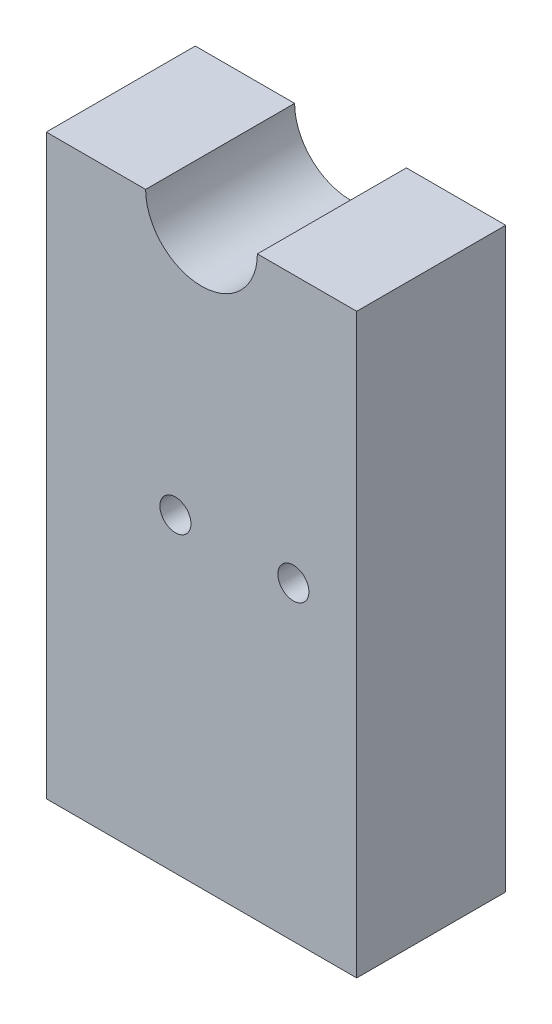
ISO-10303-21;
HEADER;
FILE_DESCRIPTION(('STEP AP214'),'2;1');
FILE_NAME('part.step','',(''),(''),'','','');
FILE_SCHEMA(('AUTOMOTIVE_DESIGN { 1 0 10303 214 1 1 1 1 }'));
ENDSEC;
DATA;
#1=APPLICATION_CONTEXT('core data for automotive mechanical design processes');
#2=APPLICATION_PROTOCOL_DEFINITION('international standard','automotive_design',2000,#1);
#3=PRODUCT_CONTEXT('',#1,'mechanical');
#4=PRODUCT('Part','Part','',(#3));
#5=PRODUCT_RELATED_PRODUCT_CATEGORY('part','',(#4));
#6=PRODUCT_DEFINITION_FORMATION('','',#4);
#7=PRODUCT_DEFINITION_CONTEXT('part definition',#1,'design');
#8=PRODUCT_DEFINITION('design','',#6,#7);
#9=PRODUCT_DEFINITION_SHAPE('','',#8);
#10=(LENGTH_UNIT() NAMED_UNIT(*) SI_UNIT(.MILLI.,.METRE.));
#11=(NAMED_UNIT(*) PLANE_ANGLE_UNIT() SI_UNIT($,.RADIAN.));
#12=(NAMED_UNIT(*) SI_UNIT($,.STERADIAN.) SOLID_ANGLE_UNIT());
#13=UNCERTAINTY_MEASURE_WITH_UNIT(LENGTH_MEASURE(1.E-05),#10,'distance_accuracy_value','');
#14=(GEOMETRIC_REPRESENTATION_CONTEXT(3) GLOBAL_UNCERTAINTY_ASSIGNED_CONTEXT((#13)) GLOBAL_UNIT_ASSIGNED_CONTEXT((#10,
#11,#12)) REPRESENTATION_CONTEXT('',''));
#15=CARTESIAN_POINT('',(0.,0.,0.));
#16=DIRECTION('',(0.,0.,1.));
#17=DIRECTION('',(1.,0.,0.));
#18=AXIS2_PLACEMENT_3D('',#15,#16,#17);
#19=CARTESIAN_POINT('',(-12.5,46.5,12.));
#20=DIRECTION('',(1.,0.,0.));
#21=DIRECTION('',(0.,1.,0.));
#22=AXIS2_PLACEMENT_3D('',#19,#20,#21);
#23=PLANE('',#22);
#24=DIRECTION('',(0.,-1.,0.));
#25=VECTOR('',#24,1.);
#26=CARTESIAN_POINT('',(-12.5,46.5,0.));
#27=LINE('',#26,#25);
#28=CARTESIAN_POINT('',(-12.5,46.5,0.));
#29=VERTEX_POINT('',#28);
#30=CARTESIAN_POINT('',(-12.5,0.,0.));
#31=VERTEX_POINT('',#30);
#32=EDGE_CURVE('E122',#29,#31,#27,.T.);
#33=ORIENTED_EDGE('',*,*,#32,.T.);
#34=DIRECTION('',(0.,0.,-1.));
#35=VECTOR('',#34,1.);
#36=CARTESIAN_POINT('',(-12.5,0.,12.));
#37=LINE('',#36,#35);
#38=CARTESIAN_POINT('',(-12.5,0.,12.));
#39=VERTEX_POINT('',#38);
#40=EDGE_CURVE('E11',#39,#31,#37,.T.);
#41=ORIENTED_EDGE('',*,*,#40,.F.);
#42=DIRECTION('',(0.,-1.,0.));
#43=VECTOR('',#42,1.);
#44=CARTESIAN_POINT('',(-12.5,46.5,12.));
#45=LINE('',#44,#43);
#46=CARTESIAN_POINT('',(-12.5,46.5,12.));
#47=VERTEX_POINT('',#46);
#48=EDGE_CURVE('E132',#47,#39,#45,.T.);
#49=ORIENTED_EDGE('',*,*,#48,.F.);
#50=DIRECTION('',(0.,0.,-1.));
#51=VECTOR('',#50,1.);
#52=CARTESIAN_POINT('',(-12.5,46.5,12.));
#53=LINE('',#52,#51);
#54=EDGE_CURVE('E118',#47,#29,#53,.T.);
#55=ORIENTED_EDGE('',*,*,#54,.T.);
#56=EDGE_LOOP('',(#33,#41,#49,#55));
#57=FACE_BOUND('',#56,.T.);
#58=ADVANCED_FACE('F36',(#57),#23,.F.);
#59=CARTESIAN_POINT('',(-12.5,0.,12.));
#60=DIRECTION('',(0.,1.,0.));
#61=DIRECTION('',(0.,0.,1.));
#62=AXIS2_PLACEMENT_3D('',#59,#60,#61);
#63=PLANE('',#62);
#64=DIRECTION('',(1.,0.,0.));
#65=VECTOR('',#64,1.);
#66=CARTESIAN_POINT('',(-12.5,0.,0.));
#67=LINE('',#66,#65);
#68=CARTESIAN_POINT('',(12.5,0.,0.));
#69=VERTEX_POINT('',#68);
#70=EDGE_CURVE('E125',#31,#69,#67,.T.);
#71=ORIENTED_EDGE('',*,*,#70,.T.);
#72=DIRECTION('',(0.,0.,-1.));
#73=VECTOR('',#72,1.);
#74=CARTESIAN_POINT('',(12.5,0.,12.));
#75=LINE('',#74,#73);
#76=CARTESIAN_POINT('',(12.5,0.,12.));
#77=VERTEX_POINT('',#76);
#78=EDGE_CURVE('E45',#77,#69,#75,.T.);
#79=ORIENTED_EDGE('',*,*,#78,.F.);
#80=DIRECTION('',(1.,0.,0.));
#81=VECTOR('',#80,1.);
#82=CARTESIAN_POINT('',(-12.5,0.,12.));
#83=LINE('',#82,#81);
#84=EDGE_CURVE('E91',#39,#77,#83,.T.);
#85=ORIENTED_EDGE('',*,*,#84,.F.);
#86=ORIENTED_EDGE('',*,*,#40,.T.);
#87=EDGE_LOOP('',(#71,#79,#85,#86));
#88=FACE_BOUND('',#87,.T.);
#89=ADVANCED_FACE('F154',(#88),#63,.F.);
#90=CARTESIAN_POINT('',(12.5,0.,12.));
#91=DIRECTION('',(-1.,0.,0.));
#92=DIRECTION('',(0.,-1.,0.));
#93=AXIS2_PLACEMENT_3D('',#90,#91,#92);
#94=PLANE('',#93);
#95=DIRECTION('',(0.,1.,0.));
#96=VECTOR('',#95,1.);
#97=CARTESIAN_POINT('',(12.5,0.,0.));
#98=LINE('',#97,#96);
#99=CARTESIAN_POINT('',(12.5,46.5,0.));
#100=VERTEX_POINT('',#99);
#101=EDGE_CURVE('E127',#69,#100,#98,.T.);
#102=ORIENTED_EDGE('',*,*,#101,.T.);
#103=DIRECTION('',(0.,0.,-1.));
#104=VECTOR('',#103,1.);
#105=CARTESIAN_POINT('',(12.5,46.5,12.));
#106=LINE('',#105,#104);
#107=CARTESIAN_POINT('',(12.5,46.5,12.));
#108=VERTEX_POINT('',#107);
#109=EDGE_CURVE('E113',#108,#100,#106,.T.);
#110=ORIENTED_EDGE('',*,*,#109,.F.);
#111=DIRECTION('',(0.,1.,0.));
#112=VECTOR('',#111,1.);
#113=CARTESIAN_POINT('',(12.5,0.,12.));
#114=LINE('',#113,#112);
#115=EDGE_CURVE('E104',#77,#108,#114,.T.);
#116=ORIENTED_EDGE('',*,*,#115,.F.);
#117=ORIENTED_EDGE('',*,*,#78,.T.);
#118=EDGE_LOOP('',(#102,#110,#116,#117));
#119=FACE_BOUND('',#118,.T.);
#120=ADVANCED_FACE('F157',(#119),#94,.F.);
#121=CARTESIAN_POINT('',(12.5,46.5,12.));
#122=DIRECTION('',(0.,-1.,0.));
#123=DIRECTION('',(1.,0.,0.));
#124=AXIS2_PLACEMENT_3D('',#121,#122,#123);
#125=PLANE('',#124);
#126=DIRECTION('',(-1.,0.,0.));
#127=VECTOR('',#126,1.);
#128=CARTESIAN_POINT('',(12.5,46.5,0.));
#129=LINE('',#128,#127);
#130=CARTESIAN_POINT('',(4.5,46.5,0.));
#131=VERTEX_POINT('',#130);
#132=EDGE_CURVE('E112',#100,#131,#129,.T.);
#133=ORIENTED_EDGE('',*,*,#132,.T.);
#134=DIRECTION('',(0.,0.,-1.));
#135=VECTOR('',#134,1.);
#136=CARTESIAN_POINT('',(4.5,46.5,12.));
#137=LINE('',#136,#135);
#138=CARTESIAN_POINT('',(4.5,46.5,12.));
#139=VERTEX_POINT('',#138);
#140=EDGE_CURVE('E109',#139,#131,#137,.T.);
#141=ORIENTED_EDGE('',*,*,#140,.F.);
#142=DIRECTION('',(-1.,0.,0.));
#143=VECTOR('',#142,1.);
#144=CARTESIAN_POINT('',(12.5,46.5,12.));
#145=LINE('',#144,#143);
#146=EDGE_CURVE('E98',#108,#139,#145,.T.);
#147=ORIENTED_EDGE('',*,*,#146,.F.);
#148=ORIENTED_EDGE('',*,*,#109,.T.);
#149=EDGE_LOOP('',(#133,#141,#147,#148));
#150=FACE_BOUND('',#149,.T.);
#151=ADVANCED_FACE('F110',(#150),#125,.F.);
#152=CARTESIAN_POINT('',(0.,46.5,12.));
#153=DIRECTION('',(0.,0.,-1.));
#154=DIRECTION('',(-1.,0.,0.));
#155=AXIS2_PLACEMENT_3D('',#152,#153,#154);
#156=CYLINDRICAL_SURFACE('',#155,4.5);
#157=CARTESIAN_POINT('',(0.,46.5,0.));
#158=DIRECTION('',(0.,0.,-1.));
#159=DIRECTION('',(1.,0.,0.));
#160=AXIS2_PLACEMENT_3D('',#157,#158,#159);
#161=CIRCLE('',#160,4.5);
#162=CARTESIAN_POINT('',(-4.5,46.5,0.));
#163=VERTEX_POINT('',#162);
#164=EDGE_CURVE('E77',#131,#163,#161,.T.);
#165=ORIENTED_EDGE('',*,*,#164,.T.);
#166=DIRECTION('',(0.,0.,-1.));
#167=VECTOR('',#166,1.);
#168=CARTESIAN_POINT('',(-4.5,46.5,12.));
#169=LINE('',#168,#167);
#170=CARTESIAN_POINT('',(-4.5,46.5,12.));
#171=VERTEX_POINT('',#170);
#172=EDGE_CURVE('E114',#171,#163,#169,.T.);
#173=ORIENTED_EDGE('',*,*,#172,.F.);
#174=CARTESIAN_POINT('',(0.,46.5,12.));
#175=DIRECTION('',(0.,0.,-1.));
#176=DIRECTION('',(1.,0.,0.));
#177=AXIS2_PLACEMENT_3D('',#174,#175,#176);
#178=CIRCLE('',#177,4.5);
#179=EDGE_CURVE('E102',#139,#171,#178,.T.);
#180=ORIENTED_EDGE('',*,*,#179,.F.);
#181=ORIENTED_EDGE('',*,*,#140,.T.);
#182=EDGE_LOOP('',(#165,#173,#180,#181));
#183=FACE_BOUND('',#182,.T.);
#184=ADVANCED_FACE('F116',(#183),#156,.F.);
#185=CARTESIAN_POINT('',(-4.5,46.5,12.));
#186=DIRECTION('',(0.,-1.,0.));
#187=DIRECTION('',(1.,0.,0.));
#188=AXIS2_PLACEMENT_3D('',#185,#186,#187);
#189=PLANE('',#188);
#190=DIRECTION('',(-1.,0.,0.));
#191=VECTOR('',#190,1.);
#192=CARTESIAN_POINT('',(-4.5,46.5,0.));
#193=LINE('',#192,#191);
#194=EDGE_CURVE('E83',#163,#29,#193,.T.);
#195=ORIENTED_EDGE('',*,*,#194,.T.);
#196=ORIENTED_EDGE('',*,*,#54,.F.);
#197=DIRECTION('',(-1.,0.,0.));
#198=VECTOR('',#197,1.);
#199=CARTESIAN_POINT('',(-4.5,46.5,12.));
#200=LINE('',#199,#198);
#201=EDGE_CURVE('E54',#171,#47,#200,.T.);
#202=ORIENTED_EDGE('',*,*,#201,.F.);
#203=ORIENTED_EDGE('',*,*,#172,.T.);
#204=EDGE_LOOP('',(#195,#196,#202,#203));
#205=FACE_BOUND('',#204,.T.);
#206=ADVANCED_FACE('F162',(#205),#189,.F.);
#207=CARTESIAN_POINT('',(0.,46.5,12.));
#208=DIRECTION('',(0.,0.,1.));
#209=DIRECTION('',(1.,0.,0.));
#210=AXIS2_PLACEMENT_3D('',#207,#208,#209);
#211=PLANE('',#210);
#212=CARTESIAN_POINT('',(7.4,25.,12.));
#213=DIRECTION('',(0.,0.,-1.));
#214=DIRECTION('',(-1.,0.,0.));
#215=AXIS2_PLACEMENT_3D('',#212,#213,#214);
#216=CIRCLE('',#215,1.25);
#217=CARTESIAN_POINT('',(6.15,25.,12.));
#218=VERTEX_POINT('',#217);
#219=EDGE_CURVE('E139',#218,#218,#216,.T.);
#220=ORIENTED_EDGE('',*,*,#219,.T.);
#221=EDGE_LOOP('',(#220));
#222=FACE_BOUND('',#221,.T.);
#223=CARTESIAN_POINT('',(-2.1,25.,12.));
#224=DIRECTION('',(0.,0.,-1.));
#225=DIRECTION('',(-1.,0.,0.));
#226=AXIS2_PLACEMENT_3D('',#223,#224,#225);
#227=CIRCLE('',#226,1.25);
#228=CARTESIAN_POINT('',(-3.35,25.,12.));
#229=VERTEX_POINT('',#228);
#230=EDGE_CURVE('E144',#229,#229,#227,.T.);
#231=ORIENTED_EDGE('',*,*,#230,.T.);
#232=EDGE_LOOP('',(#231));
#233=FACE_BOUND('',#232,.T.);
#234=ORIENTED_EDGE('',*,*,#48,.T.);
#235=ORIENTED_EDGE('',*,*,#84,.T.);
#236=ORIENTED_EDGE('',*,*,#115,.T.);
#237=ORIENTED_EDGE('',*,*,#146,.T.);
#238=ORIENTED_EDGE('',*,*,#179,.T.);
#239=ORIENTED_EDGE('',*,*,#201,.T.);
#240=EDGE_LOOP('',(#234,#235,#236,#237,#238,#239));
#241=FACE_BOUND('',#240,.T.);
#242=ADVANCED_FACE('F100',(#222,#233,#241),#211,.T.);
#243=CARTESIAN_POINT('',(0.,46.5,0.));
#244=DIRECTION('',(0.,0.,1.));
#245=DIRECTION('',(1.,0.,0.));
#246=AXIS2_PLACEMENT_3D('',#243,#244,#245);
#247=PLANE('',#246);
#248=CARTESIAN_POINT('',(7.4,25.,0.));
#249=DIRECTION('',(0.,0.,1.));
#250=DIRECTION('',(1.,0.,0.));
#251=AXIS2_PLACEMENT_3D('',#248,#249,#250);
#252=CIRCLE('',#251,1.25);
#253=CARTESIAN_POINT('',(8.65,25.,0.));
#254=VERTEX_POINT('',#253);
#255=EDGE_CURVE('E39',#254,#254,#252,.T.);
#256=ORIENTED_EDGE('',*,*,#255,.T.);
#257=EDGE_LOOP('',(#256));
#258=FACE_BOUND('',#257,.T.);
#259=CARTESIAN_POINT('',(-2.1,25.,0.));
#260=DIRECTION('',(0.,0.,1.));
#261=DIRECTION('',(1.,0.,0.));
#262=AXIS2_PLACEMENT_3D('',#259,#260,#261);
#263=CIRCLE('',#262,1.25);
#264=CARTESIAN_POINT('',(-0.850000000000001,25.,0.));
#265=VERTEX_POINT('',#264);
#266=EDGE_CURVE('E137',#265,#265,#263,.T.);
#267=ORIENTED_EDGE('',*,*,#266,.T.);
#268=EDGE_LOOP('',(#267));
#269=FACE_BOUND('',#268,.T.);
#270=ORIENTED_EDGE('',*,*,#32,.F.);
#271=ORIENTED_EDGE('',*,*,#194,.F.);
#272=ORIENTED_EDGE('',*,*,#164,.F.);
#273=ORIENTED_EDGE('',*,*,#132,.F.);
#274=ORIENTED_EDGE('',*,*,#101,.F.);
#275=ORIENTED_EDGE('',*,*,#70,.F.);
#276=EDGE_LOOP('',(#270,#271,#272,#273,#274,#275));
#277=FACE_BOUND('',#276,.T.);
#278=ADVANCED_FACE('F160',(#258,#269,#277),#247,.F.);
#279=CARTESIAN_POINT('',(-2.1,25.,12.));
#280=DIRECTION('',(0.,0.,-1.));
#281=DIRECTION('',(-1.,0.,0.));
#282=AXIS2_PLACEMENT_3D('',#279,#280,#281);
#283=CYLINDRICAL_SURFACE('',#282,1.25);
#284=ORIENTED_EDGE('',*,*,#230,.F.);
#285=EDGE_LOOP('',(#284));
#286=FACE_BOUND('',#285,.T.);
#287=ORIENTED_EDGE('',*,*,#266,.F.);
#288=EDGE_LOOP('',(#287));
#289=FACE_BOUND('',#288,.T.);
#290=ADVANCED_FACE('F212',(#286,#289),#283,.F.);
#291=CARTESIAN_POINT('',(7.4,25.,12.));
#292=DIRECTION('',(0.,0.,-1.));
#293=DIRECTION('',(-1.,0.,0.));
#294=AXIS2_PLACEMENT_3D('',#291,#292,#293);
#295=CYLINDRICAL_SURFACE('',#294,1.25);
#296=ORIENTED_EDGE('',*,*,#219,.F.);
#297=EDGE_LOOP('',(#296));
#298=FACE_BOUND('',#297,.T.);
#299=ORIENTED_EDGE('',*,*,#255,.F.);
#300=EDGE_LOOP('',(#299));
#301=FACE_BOUND('',#300,.T.);
#302=ADVANCED_FACE('F222',(#298,#301),#295,.F.);
#303=CLOSED_SHELL('',(#58,#89,#120,#151,#184,#206,#242,#278,#290,#302));
#304=MANIFOLD_SOLID_BREP('B2',#303);
#305=ADVANCED_BREP_SHAPE_REPRESENTATION('',(#18,#304),#14);
#306=SHAPE_DEFINITION_REPRESENTATION(#9,#305);
ENDSEC;
END-ISO-10303-21;
